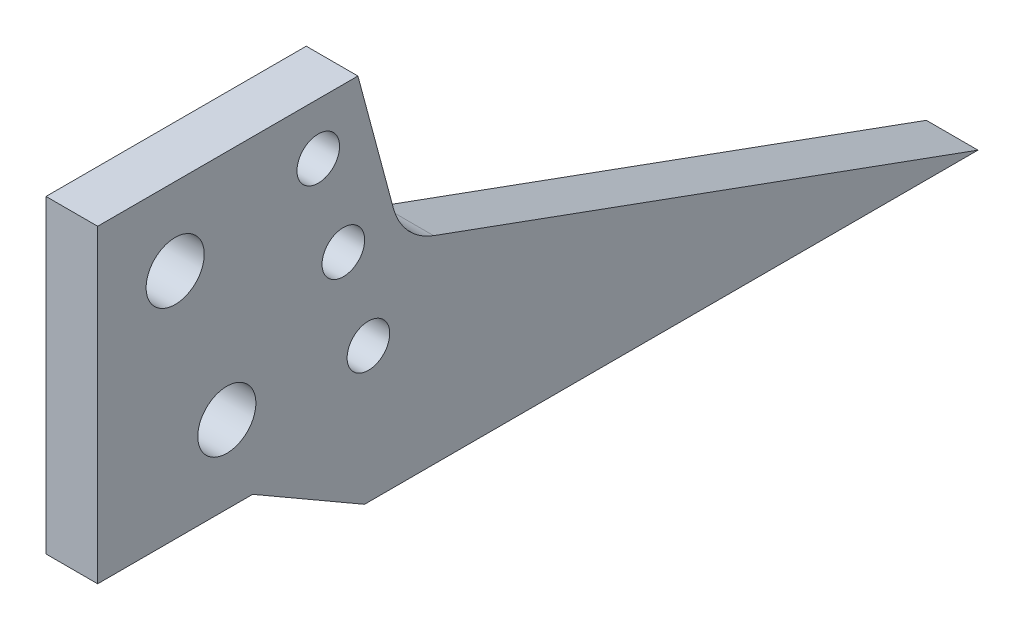
ISO-10303-21;
HEADER;
FILE_DESCRIPTION(('STEP AP214'),'2;1');
FILE_NAME('part.step','',(''),(''),'','','');
FILE_SCHEMA(('AUTOMOTIVE_DESIGN { 1 0 10303 214 1 1 1 1 }'));
ENDSEC;
DATA;
#1=APPLICATION_CONTEXT('core data for automotive mechanical design processes');
#2=APPLICATION_PROTOCOL_DEFINITION('international standard','automotive_design',2000,#1);
#3=PRODUCT_CONTEXT('',#1,'mechanical');
#4=PRODUCT('Part','Part','',(#3));
#5=PRODUCT_RELATED_PRODUCT_CATEGORY('part','',(#4));
#6=PRODUCT_DEFINITION_FORMATION('','',#4);
#7=PRODUCT_DEFINITION_CONTEXT('part definition',#1,'design');
#8=PRODUCT_DEFINITION('design','',#6,#7);
#9=PRODUCT_DEFINITION_SHAPE('','',#8);
#10=(LENGTH_UNIT() NAMED_UNIT(*) SI_UNIT(.MILLI.,.METRE.));
#11=(NAMED_UNIT(*) PLANE_ANGLE_UNIT() SI_UNIT($,.RADIAN.));
#12=(NAMED_UNIT(*) SI_UNIT($,.STERADIAN.) SOLID_ANGLE_UNIT());
#13=UNCERTAINTY_MEASURE_WITH_UNIT(LENGTH_MEASURE(1.E-05),#10,'distance_accuracy_value','');
#14=(GEOMETRIC_REPRESENTATION_CONTEXT(3) GLOBAL_UNCERTAINTY_ASSIGNED_CONTEXT((#13)) GLOBAL_UNIT_ASSIGNED_CONTEXT((#10,
#11,#12)) REPRESENTATION_CONTEXT('',''));
#15=CARTESIAN_POINT('',(0.,0.,0.));
#16=DIRECTION('',(0.,0.,1.));
#17=DIRECTION('',(1.,0.,0.));
#18=AXIS2_PLACEMENT_3D('',#15,#16,#17);
#19=CARTESIAN_POINT('',(8.,10.,-16.));
#20=DIRECTION('',(0.,1.,0.));
#21=DIRECTION('',(0.,0.,1.));
#22=AXIS2_PLACEMENT_3D('',#19,#20,#21);
#23=PLANE('',#22);
#24=DIRECTION('',(0.,0.,-1.));
#25=VECTOR('',#24,1.);
#26=CARTESIAN_POINT('',(0.,10.,-16.));
#27=LINE('',#26,#25);
#28=CARTESIAN_POINT('',(0.,9.99999999999999,7.99999999999999));
#29=VERTEX_POINT('',#28);
#30=CARTESIAN_POINT('',(0.,10.,-16.));
#31=VERTEX_POINT('',#30);
#32=EDGE_CURVE('E127',#29,#31,#27,.T.);
#33=ORIENTED_EDGE('',*,*,#32,.T.);
#34=DIRECTION('',(-1.,0.,0.));
#35=VECTOR('',#34,1.);
#36=CARTESIAN_POINT('',(8.,10.,-16.));
#37=LINE('',#36,#35);
#38=CARTESIAN_POINT('',(8.,10.,-16.));
#39=VERTEX_POINT('',#38);
#40=EDGE_CURVE('E188',#39,#31,#37,.T.);
#41=ORIENTED_EDGE('',*,*,#40,.F.);
#42=DIRECTION('',(0.,0.,-1.));
#43=VECTOR('',#42,1.);
#44=CARTESIAN_POINT('',(8.,10.,-16.));
#45=LINE('',#44,#43);
#46=CARTESIAN_POINT('',(8.,9.99999999999999,7.99999999999999));
#47=VERTEX_POINT('',#46);
#48=EDGE_CURVE('E151',#47,#39,#45,.T.);
#49=ORIENTED_EDGE('',*,*,#48,.F.);
#50=DIRECTION('',(1.,0.,0.));
#51=VECTOR('',#50,1.);
#52=CARTESIAN_POINT('',(-48.6149330272285,9.99999999999999,7.99999999999999));
#53=LINE('',#52,#51);
#54=EDGE_CURVE('E132',#29,#47,#53,.T.);
#55=ORIENTED_EDGE('',*,*,#54,.F.);
#56=EDGE_LOOP('',(#33,#41,#49,#55));
#57=FACE_BOUND('',#56,.T.);
#58=ADVANCED_FACE('F44',(#57),#23,.F.);
#59=CARTESIAN_POINT('',(8.,0.,-33.3205080756887));
#60=DIRECTION('',(0.,0.866025403784438,-0.500000000000001));
#61=DIRECTION('',(0.,0.500000000000001,0.866025403784438));
#62=AXIS2_PLACEMENT_3D('',#59,#60,#61);
#63=PLANE('',#62);
#64=DIRECTION('',(0.,-0.500000000000001,-0.866025403784438));
#65=VECTOR('',#64,1.);
#66=CARTESIAN_POINT('',(0.,0.,-33.3205080756887));
#67=LINE('',#66,#65);
#68=CARTESIAN_POINT('',(0.,0.,-33.3205080756887));
#69=VERTEX_POINT('',#68);
#70=EDGE_CURVE('E170',#31,#69,#67,.T.);
#71=ORIENTED_EDGE('',*,*,#70,.T.);
#72=DIRECTION('',(-1.,0.,0.));
#73=VECTOR('',#72,1.);
#74=CARTESIAN_POINT('',(8.,0.,-33.3205080756887));
#75=LINE('',#74,#73);
#76=CARTESIAN_POINT('',(8.,0.,-33.3205080756887));
#77=VERTEX_POINT('',#76);
#78=EDGE_CURVE('E184',#77,#69,#75,.T.);
#79=ORIENTED_EDGE('',*,*,#78,.F.);
#80=DIRECTION('',(0.,-0.500000000000001,-0.866025403784438));
#81=VECTOR('',#80,1.);
#82=CARTESIAN_POINT('',(8.,0.,-33.3205080756887));
#83=LINE('',#82,#81);
#84=EDGE_CURVE('E154',#39,#77,#83,.T.);
#85=ORIENTED_EDGE('',*,*,#84,.F.);
#86=ORIENTED_EDGE('',*,*,#40,.T.);
#87=EDGE_LOOP('',(#71,#79,#85,#86));
#88=FACE_BOUND('',#87,.T.);
#89=ADVANCED_FACE('F335',(#88),#63,.F.);
#90=CARTESIAN_POINT('',(8.,0.,-33.3205080756887));
#91=DIRECTION('',(0.,1.,0.));
#92=DIRECTION('',(0.,0.,1.));
#93=AXIS2_PLACEMENT_3D('',#90,#91,#92);
#94=PLANE('',#93);
#95=DIRECTION('',(0.,0.,-1.));
#96=VECTOR('',#95,1.);
#97=CARTESIAN_POINT('',(0.,0.,-33.3205080756887));
#98=LINE('',#97,#96);
#99=CARTESIAN_POINT('',(0.,0.,-128.320508075689));
#100=VERTEX_POINT('',#99);
#101=EDGE_CURVE('E173',#69,#100,#98,.T.);
#102=ORIENTED_EDGE('',*,*,#101,.T.);
#103=DIRECTION('',(-1.,0.,0.));
#104=VECTOR('',#103,1.);
#105=CARTESIAN_POINT('',(8.,0.,-128.320508075689));
#106=LINE('',#105,#104);
#107=CARTESIAN_POINT('',(8.,0.,-128.320508075689));
#108=VERTEX_POINT('',#107);
#109=EDGE_CURVE('E167',#108,#100,#106,.T.);
#110=ORIENTED_EDGE('',*,*,#109,.F.);
#111=DIRECTION('',(0.,0.,-1.));
#112=VECTOR('',#111,1.);
#113=CARTESIAN_POINT('',(8.,0.,-33.3205080756887));
#114=LINE('',#113,#112);
#115=EDGE_CURVE('E158',#77,#108,#114,.T.);
#116=ORIENTED_EDGE('',*,*,#115,.F.);
#117=ORIENTED_EDGE('',*,*,#78,.T.);
#118=EDGE_LOOP('',(#102,#110,#116,#117));
#119=FACE_BOUND('',#118,.T.);
#120=ADVANCED_FACE('F338',(#119),#94,.F.);
#121=CARTESIAN_POINT('',(8.,0.,-128.320508075689));
#122=DIRECTION('',(0.,-0.939692620785911,0.342020143325663));
#123=DIRECTION('',(0.,-0.342020143325663,-0.939692620785911));
#124=AXIS2_PLACEMENT_3D('',#121,#122,#123);
#125=PLANE('',#124);
#126=DIRECTION('',(0.,0.342020143325663,0.939692620785911));
#127=VECTOR('',#126,1.);
#128=CARTESIAN_POINT('',(0.,0.,-128.320508075689));
#129=LINE('',#128,#127);
#130=CARTESIAN_POINT('',(0.,30.6822908586107,-44.0216067645152));
#131=VERTEX_POINT('',#130);
#132=EDGE_CURVE('E176',#100,#131,#129,.T.);
#133=ORIENTED_EDGE('',*,*,#132,.T.);
#134=DIRECTION('',(-1.,0.,0.));
#135=VECTOR('',#134,1.);
#136=CARTESIAN_POINT('',(8.,30.6822908586107,-44.0216067645152));
#137=LINE('',#136,#135);
#138=CARTESIAN_POINT('',(8.,30.6822908586107,-44.0216067645152));
#139=VERTEX_POINT('',#138);
#140=EDGE_CURVE('E60',#131,#139,#137,.F.);
#141=ORIENTED_EDGE('',*,*,#140,.T.);
#142=DIRECTION('',(0.,0.342020143325663,0.939692620785911));
#143=VECTOR('',#142,1.);
#144=CARTESIAN_POINT('',(8.,0.,-128.320508075689));
#145=LINE('',#144,#143);
#146=EDGE_CURVE('E161',#108,#139,#145,.T.);
#147=ORIENTED_EDGE('',*,*,#146,.F.);
#148=ORIENTED_EDGE('',*,*,#109,.T.);
#149=EDGE_LOOP('',(#133,#141,#147,#148));
#150=FACE_BOUND('',#149,.T.);
#151=ADVANCED_FACE('F339',(#150),#125,.F.);
#152=CARTESIAN_POINT('',(8.,74.,-28.));
#153=DIRECTION('',(0.,-0.258819045102525,0.965925826289067));
#154=DIRECTION('',(0.,-0.965925826289067,-0.258819045102525));
#155=AXIS2_PLACEMENT_3D('',#152,#153,#154);
#156=PLANE('',#155);
#157=DIRECTION('',(0.,0.965925826289067,0.258819045102525));
#158=VECTOR('',#157,1.);
#159=CARTESIAN_POINT('',(8.,74.,-28.));
#160=LINE('',#159,#158);
#161=CARTESIAN_POINT('',(8.,37.4910266154445,-37.7825499348812));
#162=VERTEX_POINT('',#161);
#163=CARTESIAN_POINT('',(8.,57.9521815274541,-32.3));
#164=VERTEX_POINT('',#163);
#165=EDGE_CURVE('E164',#162,#164,#160,.T.);
#166=ORIENTED_EDGE('',*,*,#165,.F.);
#167=DIRECTION('',(-1.,0.,0.));
#168=VECTOR('',#167,1.);
#169=CARTESIAN_POINT('',(0.,37.4910266154445,-37.7825499348812));
#170=LINE('',#169,#168);
#171=CARTESIAN_POINT('',(0.,37.4910266154445,-37.7825499348812));
#172=VERTEX_POINT('',#171);
#173=EDGE_CURVE('E192',#162,#172,#170,.T.);
#174=ORIENTED_EDGE('',*,*,#173,.T.);
#175=DIRECTION('',(0.,0.965925826289067,0.258819045102525));
#176=VECTOR('',#175,1.);
#177=CARTESIAN_POINT('',(0.,74.,-28.));
#178=LINE('',#177,#176);
#179=CARTESIAN_POINT('',(0.,57.9521815274541,-32.3));
#180=VERTEX_POINT('',#179);
#181=EDGE_CURVE('E155',#172,#180,#178,.T.);
#182=ORIENTED_EDGE('',*,*,#181,.T.);
#183=DIRECTION('',(1.,0.,0.));
#184=VECTOR('',#183,1.);
#185=CARTESIAN_POINT('',(0.,57.9521815274541,-32.3));
#186=LINE('',#185,#184);
#187=EDGE_CURVE('E119',#180,#164,#186,.T.);
#188=ORIENTED_EDGE('',*,*,#187,.T.);
#189=EDGE_LOOP('',(#166,#174,#182,#188));
#190=FACE_BOUND('',#189,.T.);
#191=ADVANCED_FACE('F313',(#190),#156,.F.);
#192=CARTESIAN_POINT('',(8.,0.,0.));
#193=DIRECTION('',(-1.,0.,0.));
#194=DIRECTION('',(0.,0.,1.));
#195=AXIS2_PLACEMENT_3D('',#192,#193,#194);
#196=PLANE('',#195);
#197=CARTESIAN_POINT('',(8.,49.9521815274541,-26.1613840961684));
#198=DIRECTION('',(1.,0.,0.));
#199=DIRECTION('',(0.,0.,-1.));
#200=AXIS2_PLACEMENT_3D('',#197,#198,#199);
#201=CIRCLE('',#200,3.3);
#202=CARTESIAN_POINT('',(8.,49.9521815274541,-29.4613840961684));
#203=VERTEX_POINT('',#202);
#204=EDGE_CURVE('E229',#203,#203,#201,.T.);
#205=ORIENTED_EDGE('',*,*,#204,.F.);
#206=EDGE_LOOP('',(#205));
#207=FACE_BOUND('',#206,.T.);
#208=CARTESIAN_POINT('',(8.,35.4632941331181,-30.0436697727062));
#209=DIRECTION('',(1.,0.,0.));
#210=DIRECTION('',(0.,0.,-1.));
#211=AXIS2_PLACEMENT_3D('',#208,#209,#210);
#212=CIRCLE('',#211,3.3);
#213=CARTESIAN_POINT('',(8.,35.4632941331181,-33.3436697727062));
#214=VERTEX_POINT('',#213);
#215=EDGE_CURVE('E272',#214,#214,#212,.T.);
#216=ORIENTED_EDGE('',*,*,#215,.F.);
#217=EDGE_LOOP('',(#216));
#218=FACE_BOUND('',#217,.T.);
#219=CARTESIAN_POINT('',(8.,20.9744067387821,-33.925955449244));
#220=DIRECTION('',(1.,0.,0.));
#221=DIRECTION('',(0.,0.,-1.));
#222=AXIS2_PLACEMENT_3D('',#219,#220,#221);
#223=CIRCLE('',#222,3.3);
#224=CARTESIAN_POINT('',(8.,20.9744067387821,-37.225955449244));
#225=VERTEX_POINT('',#224);
#226=EDGE_CURVE('E252',#225,#225,#223,.T.);
#227=ORIENTED_EDGE('',*,*,#226,.F.);
#228=EDGE_LOOP('',(#227));
#229=FACE_BOUND('',#228,.T.);
#230=CARTESIAN_POINT('',(8.,45.9521815274541,-4.));
#231=DIRECTION('',(-1.,0.,0.));
#232=DIRECTION('',(0.,0.,1.));
#233=AXIS2_PLACEMENT_3D('',#230,#231,#232);
#234=CIRCLE('',#233,4.5);
#235=CARTESIAN_POINT('',(8.,45.9521815274541,0.499999999999995));
#236=VERTEX_POINT('',#235);
#237=EDGE_CURVE('E225',#236,#236,#234,.T.);
#238=ORIENTED_EDGE('',*,*,#237,.T.);
#239=EDGE_LOOP('',(#238));
#240=FACE_BOUND('',#239,.T.);
#241=CARTESIAN_POINT('',(8.,22.,-12.));
#242=DIRECTION('',(-1.,0.,0.));
#243=DIRECTION('',(0.,0.,1.));
#244=AXIS2_PLACEMENT_3D('',#241,#242,#243);
#245=CIRCLE('',#244,4.5);
#246=CARTESIAN_POINT('',(8.,22.,-7.5));
#247=VERTEX_POINT('',#246);
#248=EDGE_CURVE('E143',#247,#247,#245,.T.);
#249=ORIENTED_EDGE('',*,*,#248,.T.);
#250=EDGE_LOOP('',(#249));
#251=FACE_BOUND('',#250,.T.);
#252=ORIENTED_EDGE('',*,*,#146,.T.);
#253=CARTESIAN_POINT('',(8.,40.0792170664698,-47.4418081977718));
#254=DIRECTION('',(-1.,0.,0.));
#255=DIRECTION('',(0.,0.,1.));
#256=AXIS2_PLACEMENT_3D('',#253,#254,#255);
#257=CIRCLE('',#256,10.);
#258=EDGE_CURVE('E11',#139,#162,#257,.T.);
#259=ORIENTED_EDGE('',*,*,#258,.T.);
#260=ORIENTED_EDGE('',*,*,#165,.T.);
#261=DIRECTION('',(0.,0.,-1.));
#262=VECTOR('',#261,1.);
#263=CARTESIAN_POINT('',(8.,57.9521815274541,0.));
#264=LINE('',#263,#262);
#265=CARTESIAN_POINT('',(8.,57.9521815274541,8.));
#266=VERTEX_POINT('',#265);
#267=EDGE_CURVE('E121',#266,#164,#264,.T.);
#268=ORIENTED_EDGE('',*,*,#267,.F.);
#269=DIRECTION('',(0.,-1.,0.));
#270=VECTOR('',#269,1.);
#271=CARTESIAN_POINT('',(8.,57.9521815274541,8.));
#272=LINE('',#271,#270);
#273=EDGE_CURVE('E136',#266,#47,#272,.T.);
#274=ORIENTED_EDGE('',*,*,#273,.T.);
#275=ORIENTED_EDGE('',*,*,#48,.T.);
#276=ORIENTED_EDGE('',*,*,#84,.T.);
#277=ORIENTED_EDGE('',*,*,#115,.T.);
#278=EDGE_LOOP('',(#252,#259,#260,#268,#274,#275,#276,#277));
#279=FACE_BOUND('',#278,.T.);
#280=ADVANCED_FACE('F310',(#207,#218,#229,#240,#251,#279),#196,.F.);
#281=CARTESIAN_POINT('',(0.,0.,0.));
#282=DIRECTION('',(-1.,0.,0.));
#283=DIRECTION('',(0.,0.,1.));
#284=AXIS2_PLACEMENT_3D('',#281,#282,#283);
#285=PLANE('',#284);
#286=CARTESIAN_POINT('',(0.,49.9521815274541,-26.1613840961684));
#287=DIRECTION('',(1.,0.,0.));
#288=DIRECTION('',(0.,0.,-1.));
#289=AXIS2_PLACEMENT_3D('',#286,#287,#288);
#290=CIRCLE('',#289,3.3);
#291=CARTESIAN_POINT('',(0.,49.9521815274541,-29.4613840961684));
#292=VERTEX_POINT('',#291);
#293=EDGE_CURVE('E232',#292,#292,#290,.T.);
#294=ORIENTED_EDGE('',*,*,#293,.T.);
#295=EDGE_LOOP('',(#294));
#296=FACE_BOUND('',#295,.T.);
#297=CARTESIAN_POINT('',(0.,35.4632941331181,-30.0436697727062));
#298=DIRECTION('',(1.,0.,0.));
#299=DIRECTION('',(0.,0.,-1.));
#300=AXIS2_PLACEMENT_3D('',#297,#298,#299);
#301=CIRCLE('',#300,3.3);
#302=CARTESIAN_POINT('',(0.,35.4632941331181,-33.3436697727062));
#303=VERTEX_POINT('',#302);
#304=EDGE_CURVE('E256',#303,#303,#301,.T.);
#305=ORIENTED_EDGE('',*,*,#304,.T.);
#306=EDGE_LOOP('',(#305));
#307=FACE_BOUND('',#306,.T.);
#308=CARTESIAN_POINT('',(0.,20.9744067387821,-33.925955449244));
#309=DIRECTION('',(1.,0.,0.));
#310=DIRECTION('',(0.,0.,-1.));
#311=AXIS2_PLACEMENT_3D('',#308,#309,#310);
#312=CIRCLE('',#311,3.3);
#313=CARTESIAN_POINT('',(0.,20.9744067387821,-37.225955449244));
#314=VERTEX_POINT('',#313);
#315=EDGE_CURVE('E255',#314,#314,#312,.T.);
#316=ORIENTED_EDGE('',*,*,#315,.T.);
#317=EDGE_LOOP('',(#316));
#318=FACE_BOUND('',#317,.T.);
#319=CARTESIAN_POINT('',(0.,45.9521815274541,-4.));
#320=DIRECTION('',(-1.,0.,0.));
#321=DIRECTION('',(0.,0.,1.));
#322=AXIS2_PLACEMENT_3D('',#319,#320,#321);
#323=CIRCLE('',#322,4.49999999999999);
#324=CARTESIAN_POINT('',(0.,45.9521815274541,0.499999999999988));
#325=VERTEX_POINT('',#324);
#326=EDGE_CURVE('E248',#325,#325,#323,.T.);
#327=ORIENTED_EDGE('',*,*,#326,.F.);
#328=EDGE_LOOP('',(#327));
#329=FACE_BOUND('',#328,.T.);
#330=CARTESIAN_POINT('',(0.,22.,-12.));
#331=DIRECTION('',(-1.,0.,0.));
#332=DIRECTION('',(0.,0.,1.));
#333=AXIS2_PLACEMENT_3D('',#330,#331,#332);
#334=CIRCLE('',#333,4.49999999999999);
#335=CARTESIAN_POINT('',(0.,22.,-7.50000000000001));
#336=VERTEX_POINT('',#335);
#337=EDGE_CURVE('E206',#336,#336,#334,.T.);
#338=ORIENTED_EDGE('',*,*,#337,.F.);
#339=EDGE_LOOP('',(#338));
#340=FACE_BOUND('',#339,.T.);
#341=DIRECTION('',(0.,0.,-1.));
#342=VECTOR('',#341,1.);
#343=CARTESIAN_POINT('',(0.,57.9521815274541,0.));
#344=LINE('',#343,#342);
#345=CARTESIAN_POINT('',(0.,57.9521815274541,8.));
#346=VERTEX_POINT('',#345);
#347=EDGE_CURVE('E111',#346,#180,#344,.T.);
#348=ORIENTED_EDGE('',*,*,#347,.T.);
#349=ORIENTED_EDGE('',*,*,#181,.F.);
#350=CARTESIAN_POINT('',(0.,40.0792170664698,-47.4418081977718));
#351=DIRECTION('',(-1.,0.,0.));
#352=DIRECTION('',(0.,0.,1.));
#353=AXIS2_PLACEMENT_3D('',#350,#351,#352);
#354=CIRCLE('',#353,10.);
#355=EDGE_CURVE('E53',#172,#131,#354,.F.);
#356=ORIENTED_EDGE('',*,*,#355,.T.);
#357=ORIENTED_EDGE('',*,*,#132,.F.);
#358=ORIENTED_EDGE('',*,*,#101,.F.);
#359=ORIENTED_EDGE('',*,*,#70,.F.);
#360=ORIENTED_EDGE('',*,*,#32,.F.);
#361=DIRECTION('',(0.,-1.,0.));
#362=VECTOR('',#361,1.);
#363=CARTESIAN_POINT('',(0.,57.9521815274541,8.));
#364=LINE('',#363,#362);
#365=EDGE_CURVE('E124',#346,#29,#364,.T.);
#366=ORIENTED_EDGE('',*,*,#365,.F.);
#367=EDGE_LOOP('',(#348,#349,#356,#357,#358,#359,#360,#366));
#368=FACE_BOUND('',#367,.T.);
#369=ADVANCED_FACE('F125',(#296,#307,#318,#329,#340,#368),#285,.T.);
#370=CARTESIAN_POINT('',(0.,57.9521815274541,0.));
#371=DIRECTION('',(0.,-1.,0.));
#372=DIRECTION('',(0.,0.,-1.));
#373=AXIS2_PLACEMENT_3D('',#370,#371,#372);
#374=PLANE('',#373);
#375=ORIENTED_EDGE('',*,*,#267,.T.);
#376=ORIENTED_EDGE('',*,*,#187,.F.);
#377=ORIENTED_EDGE('',*,*,#347,.F.);
#378=DIRECTION('',(1.,0.,0.));
#379=VECTOR('',#378,1.);
#380=CARTESIAN_POINT('',(-48.6149330272285,57.9521815274541,8.));
#381=LINE('',#380,#379);
#382=EDGE_CURVE('E116',#346,#266,#381,.T.);
#383=ORIENTED_EDGE('',*,*,#382,.T.);
#384=EDGE_LOOP('',(#375,#376,#377,#383));
#385=FACE_BOUND('',#384,.T.);
#386=ADVANCED_FACE('F114',(#385),#374,.F.);
#387=CARTESIAN_POINT('',(-48.6149330272285,57.9521815274541,8.));
#388=DIRECTION('',(0.,0.,1.));
#389=DIRECTION('',(0.,-1.,0.));
#390=AXIS2_PLACEMENT_3D('',#387,#388,#389);
#391=PLANE('',#390);
#392=ORIENTED_EDGE('',*,*,#382,.F.);
#393=ORIENTED_EDGE('',*,*,#365,.T.);
#394=ORIENTED_EDGE('',*,*,#54,.T.);
#395=ORIENTED_EDGE('',*,*,#273,.F.);
#396=EDGE_LOOP('',(#392,#393,#394,#395));
#397=FACE_BOUND('',#396,.T.);
#398=ADVANCED_FACE('F134',(#397),#391,.T.);
#399=CARTESIAN_POINT('',(0.,22.,-12.));
#400=DIRECTION('',(-1.,0.,0.));
#401=DIRECTION('',(0.,0.,1.));
#402=AXIS2_PLACEMENT_3D('',#399,#400,#401);
#403=CYLINDRICAL_SURFACE('',#402,4.49999999999999);
#404=ORIENTED_EDGE('',*,*,#248,.F.);
#405=EDGE_LOOP('',(#404));
#406=FACE_BOUND('',#405,.T.);
#407=ORIENTED_EDGE('',*,*,#337,.T.);
#408=EDGE_LOOP('',(#407));
#409=FACE_BOUND('',#408,.T.);
#410=ADVANCED_FACE('F392',(#406,#409),#403,.F.);
#411=CARTESIAN_POINT('',(0.,45.9521815274541,-4.));
#412=DIRECTION('',(-1.,0.,0.));
#413=DIRECTION('',(0.,0.,1.));
#414=AXIS2_PLACEMENT_3D('',#411,#412,#413);
#415=CYLINDRICAL_SURFACE('',#414,4.49999999999999);
#416=ORIENTED_EDGE('',*,*,#237,.F.);
#417=EDGE_LOOP('',(#416));
#418=FACE_BOUND('',#417,.T.);
#419=ORIENTED_EDGE('',*,*,#326,.T.);
#420=EDGE_LOOP('',(#419));
#421=FACE_BOUND('',#420,.T.);
#422=ADVANCED_FACE('F400',(#418,#421),#415,.F.);
#423=CARTESIAN_POINT('',(8.,20.9744067387821,-33.925955449244));
#424=DIRECTION('',(1.,0.,0.));
#425=DIRECTION('',(0.,0.,-1.));
#426=AXIS2_PLACEMENT_3D('',#423,#424,#425);
#427=CYLINDRICAL_SURFACE('',#426,3.3);
#428=ORIENTED_EDGE('',*,*,#315,.F.);
#429=EDGE_LOOP('',(#428));
#430=FACE_BOUND('',#429,.T.);
#431=ORIENTED_EDGE('',*,*,#226,.T.);
#432=EDGE_LOOP('',(#431));
#433=FACE_BOUND('',#432,.T.);
#434=ADVANCED_FACE('F409',(#430,#433),#427,.F.);
#435=CARTESIAN_POINT('',(8.,35.4632941331181,-30.0436697727062));
#436=DIRECTION('',(1.,0.,0.));
#437=DIRECTION('',(0.,0.,-1.));
#438=AXIS2_PLACEMENT_3D('',#435,#436,#437);
#439=CYLINDRICAL_SURFACE('',#438,3.3);
#440=ORIENTED_EDGE('',*,*,#304,.F.);
#441=EDGE_LOOP('',(#440));
#442=FACE_BOUND('',#441,.T.);
#443=ORIENTED_EDGE('',*,*,#215,.T.);
#444=EDGE_LOOP('',(#443));
#445=FACE_BOUND('',#444,.T.);
#446=ADVANCED_FACE('F306',(#442,#445),#439,.F.);
#447=CARTESIAN_POINT('',(8.,49.9521815274541,-26.1613840961684));
#448=DIRECTION('',(1.,0.,0.));
#449=DIRECTION('',(0.,0.,-1.));
#450=AXIS2_PLACEMENT_3D('',#447,#448,#449);
#451=CYLINDRICAL_SURFACE('',#450,3.3);
#452=ORIENTED_EDGE('',*,*,#293,.F.);
#453=EDGE_LOOP('',(#452));
#454=FACE_BOUND('',#453,.T.);
#455=ORIENTED_EDGE('',*,*,#204,.T.);
#456=EDGE_LOOP('',(#455));
#457=FACE_BOUND('',#456,.T.);
#458=ADVANCED_FACE('F303',(#454,#457),#451,.F.);
#459=CARTESIAN_POINT('',(8.,40.0792170664698,-47.4418081977718));
#460=DIRECTION('',(1.,0.,0.));
#461=DIRECTION('',(0.,0.,-1.));
#462=AXIS2_PLACEMENT_3D('',#459,#460,#461);
#463=CYLINDRICAL_SURFACE('',#462,10.);
#464=ORIENTED_EDGE('',*,*,#258,.F.);
#465=ORIENTED_EDGE('',*,*,#140,.F.);
#466=ORIENTED_EDGE('',*,*,#355,.F.);
#467=ORIENTED_EDGE('',*,*,#173,.F.);
#468=EDGE_LOOP('',(#464,#465,#466,#467));
#469=FACE_BOUND('',#468,.T.);
#470=ADVANCED_FACE('F46',(#469),#463,.F.);
#471=CLOSED_SHELL('',(#58,#89,#120,#151,#191,#280,#369,#386,#398,#410,#422,#434,#446,#458,#470));
#472=MANIFOLD_SOLID_BREP('B2',#471);
#473=ADVANCED_BREP_SHAPE_REPRESENTATION('',(#18,#472),#14);
#474=SHAPE_DEFINITION_REPRESENTATION(#9,#473);
ENDSEC;
END-ISO-10303-21;
